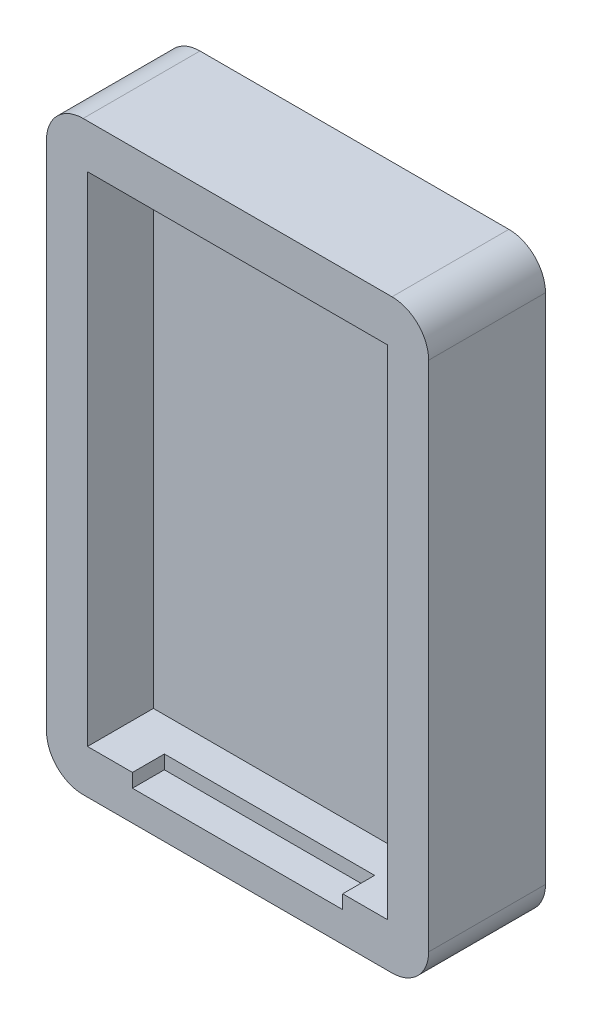
ISO-10303-21;
HEADER;
FILE_DESCRIPTION(('STEP AP214'),'2;1');
FILE_NAME('part.step','',(''),(''),'','','');
FILE_SCHEMA(('AUTOMOTIVE_DESIGN { 1 0 10303 214 1 1 1 1 }'));
ENDSEC;
DATA;
#1=APPLICATION_CONTEXT('core data for automotive mechanical design processes');
#2=APPLICATION_PROTOCOL_DEFINITION('international standard','automotive_design',2000,#1);
#3=PRODUCT_CONTEXT('',#1,'mechanical');
#4=PRODUCT('Part','Part','',(#3));
#5=PRODUCT_RELATED_PRODUCT_CATEGORY('part','',(#4));
#6=PRODUCT_DEFINITION_FORMATION('','',#4);
#7=PRODUCT_DEFINITION_CONTEXT('part definition',#1,'design');
#8=PRODUCT_DEFINITION('design','',#6,#7);
#9=PRODUCT_DEFINITION_SHAPE('','',#8);
#10=(LENGTH_UNIT() NAMED_UNIT(*) SI_UNIT(.MILLI.,.METRE.));
#11=(NAMED_UNIT(*) PLANE_ANGLE_UNIT() SI_UNIT($,.RADIAN.));
#12=(NAMED_UNIT(*) SI_UNIT($,.STERADIAN.) SOLID_ANGLE_UNIT());
#13=UNCERTAINTY_MEASURE_WITH_UNIT(LENGTH_MEASURE(1.E-05),#10,'distance_accuracy_value','');
#14=(GEOMETRIC_REPRESENTATION_CONTEXT(3) GLOBAL_UNCERTAINTY_ASSIGNED_CONTEXT((#13)) GLOBAL_UNIT_ASSIGNED_CONTEXT((#10,
#11,#12)) REPRESENTATION_CONTEXT('',''));
#15=CARTESIAN_POINT('',(0.,0.,0.));
#16=DIRECTION('',(0.,0.,1.));
#17=DIRECTION('',(1.,0.,0.));
#18=AXIS2_PLACEMENT_3D('',#15,#16,#17);
#19=CARTESIAN_POINT('',(17.8228337302219,-28.6808217788499,-0.869219482411513));
#20=DIRECTION('',(0.,0.,1.));
#21=DIRECTION('',(1.,0.,0.));
#22=AXIS2_PLACEMENT_3D('',#19,#20,#21);
#23=PLANE('',#22);
#24=CARTESIAN_POINT('',(-103.2770625763,171.81781820729,-0.869219482411513));
#25=DIRECTION('',(0.,0.,-1.));
#26=DIRECTION('',(0.999491561090101,-0.0318844681572752,0.));
#27=AXIS2_PLACEMENT_3D('',#24,#25,#26);
#28=ELLIPSE('',#27,16.5689936961627,16.3639975368076);
#29=CARTESIAN_POINT('',(-86.7164932012302,171.289524655387,-0.869219482411513));
#30=VERTEX_POINT('',#29);
#31=CARTESIAN_POINT('',(-119.837631828693,172.346115604763,-0.869219482411513));
#32=VERTEX_POINT('',#31);
#33=EDGE_CURVE('E254',#30,#32,#28,.T.);
#34=ORIENTED_EDGE('',*,*,#33,.F.);
#35=CARTESIAN_POINT('',(-103.187550418865,202.39162856633,-0.869219482411513));
#36=CARTESIAN_POINT('',(-97.0157481711161,192.57981872265,-0.869219482411513));
#37=CARTESIAN_POINT('',(-86.9706131775563,183.759430538106,-0.869219482411513));
#38=CARTESIAN_POINT('',(-86.7164930785539,171.289528500957,-0.869219482411513));
#39=B_SPLINE_CURVE_WITH_KNOTS('',3,(#35,#36,#37,#38),.UNSPECIFIED.,.F.,.F.,(4,4),(0.,1.),.UNSPECIFIED.);
#40=CARTESIAN_POINT('',(-103.187550418865,202.39162856633,-0.869219482411513));
#41=VERTEX_POINT('',#40);
#42=EDGE_CURVE('E54',#41,#30,#39,.T.);
#43=ORIENTED_EDGE('',*,*,#42,.F.);
#44=CARTESIAN_POINT('',(-103.187550418865,202.39162856633,-0.869219482411513));
#45=CARTESIAN_POINT('',(-109.364943968374,193.194693065367,-0.869219482411513));
#46=CARTESIAN_POINT('',(-118.472658707236,183.975428389587,-0.869219482411513));
#47=CARTESIAN_POINT('',(-119.837631828693,172.346115604763,-0.869219482411513));
#48=B_SPLINE_CURVE_WITH_KNOTS('',3,(#44,#45,#46,#47),.UNSPECIFIED.,.F.,.F.,(4,4),(0.,1.),.UNSPECIFIED.);
#49=EDGE_CURVE('E522',#41,#32,#48,.T.);
#50=ORIENTED_EDGE('',*,*,#49,.T.);
#51=EDGE_LOOP('',(#34,#43,#50));
#52=FACE_BOUND('',#51,.T.);
#53=DIRECTION('',(-1.,0.,0.));
#54=VECTOR('',#53,1.);
#55=CARTESIAN_POINT('',(17.8228337302219,197.176670786636,-0.869219482411513));
#56=LINE('',#55,#54);
#57=CARTESIAN_POINT('',(-127.369816398849,197.176670786636,-0.869219482411513));
#58=VERTEX_POINT('',#57);
#59=CARTESIAN_POINT('',(-134.441969819244,197.176670786636,-0.869219482411513));
#60=VERTEX_POINT('',#59);
#61=EDGE_CURVE('E237',#58,#60,#56,.T.);
#62=ORIENTED_EDGE('',*,*,#61,.T.);
#63=DIRECTION('',(0.,-1.,0.));
#64=VECTOR('',#63,1.);
#65=CARTESIAN_POINT('',(-134.441969819244,-28.6808217788499,-0.869219482411513));
#66=LINE('',#65,#64);
#67=CARTESIAN_POINT('',(-134.441969819244,174.673309565571,-0.869219482411513));
#68=VERTEX_POINT('',#67);
#69=EDGE_CURVE('E241',#60,#68,#66,.T.);
#70=ORIENTED_EDGE('',*,*,#69,.T.);
#71=DIRECTION('',(1.,0.,0.));
#72=VECTOR('',#71,1.);
#73=CARTESIAN_POINT('',(17.8228337302219,174.673309565571,-0.869219482411513));
#74=LINE('',#73,#72);
#75=CARTESIAN_POINT('',(-127.106833584018,174.673309565571,-0.869219482411513));
#76=VERTEX_POINT('',#75);
#77=EDGE_CURVE('E501',#68,#76,#74,.T.);
#78=ORIENTED_EDGE('',*,*,#77,.T.);
#79=DIRECTION('',(-0.0116855813721816,0.999931721263004,0.));
#80=VECTOR('',#79,1.);
#81=CARTESIAN_POINT('',(-124.710894032739,-30.3465249850154,-0.869219482411513));
#82=LINE('',#81,#80);
#83=EDGE_CURVE('E497',#76,#58,#82,.T.);
#84=ORIENTED_EDGE('',*,*,#83,.T.);
#85=EDGE_LOOP('',(#62,#70,#78,#84));
#86=FACE_BOUND('',#85,.T.);
#87=DIRECTION('',(0.,1.,0.));
#88=VECTOR('',#87,1.);
#89=CARTESIAN_POINT('',(-84.9322670141432,218.727352077467,-0.869219482411513));
#90=LINE('',#89,#88);
#91=CARTESIAN_POINT('',(-84.9322670141432,143.727352077467,-0.869219482411513));
#92=VERTEX_POINT('',#91);
#93=CARTESIAN_POINT('',(-84.9322670141432,213.727352077467,-0.869219482411513));
#94=VERTEX_POINT('',#93);
#95=EDGE_CURVE('E399',#92,#94,#90,.T.);
#96=ORIENTED_EDGE('',*,*,#95,.F.);
#97=CARTESIAN_POINT('',(-89.9322670141432,143.727352077467,-0.869219482411513));
#98=DIRECTION('',(0.,0.,1.));
#99=DIRECTION('',(1.,0.,0.));
#100=AXIS2_PLACEMENT_3D('',#97,#98,#99);
#101=CIRCLE('',#100,5.);
#102=CARTESIAN_POINT('',(-89.9322670141432,138.727352077467,-0.869219482411513));
#103=VERTEX_POINT('',#102);
#104=EDGE_CURVE('E386',#92,#103,#101,.F.);
#105=ORIENTED_EDGE('',*,*,#104,.T.);
#106=DIRECTION('',(1.,0.,0.));
#107=VECTOR('',#106,1.);
#108=CARTESIAN_POINT('',(-137.132267014143,138.727352077467,-0.869219482411513));
#109=LINE('',#108,#107);
#110=CARTESIAN_POINT('',(-132.132267014143,138.727352077467,-0.869219482411513));
#111=VERTEX_POINT('',#110);
#112=EDGE_CURVE('E402',#111,#103,#109,.T.);
#113=ORIENTED_EDGE('',*,*,#112,.F.);
#114=CARTESIAN_POINT('',(-132.132267014143,143.727352077467,-0.869219482411513));
#115=DIRECTION('',(0.,0.,1.));
#116=DIRECTION('',(1.,0.,0.));
#117=AXIS2_PLACEMENT_3D('',#114,#115,#116);
#118=CIRCLE('',#117,5.);
#119=CARTESIAN_POINT('',(-137.132267014143,143.727352077467,-0.869219482411513));
#120=VERTEX_POINT('',#119);
#121=EDGE_CURVE('E388',#111,#120,#118,.F.);
#122=ORIENTED_EDGE('',*,*,#121,.T.);
#123=DIRECTION('',(0.,-1.,0.));
#124=VECTOR('',#123,1.);
#125=CARTESIAN_POINT('',(-137.132267014143,218.727352077467,-0.869219482411513));
#126=LINE('',#125,#124);
#127=CARTESIAN_POINT('',(-137.132267014143,213.727352077467,-0.869219482411513));
#128=VERTEX_POINT('',#127);
#129=EDGE_CURVE('E405',#128,#120,#126,.T.);
#130=ORIENTED_EDGE('',*,*,#129,.F.);
#131=CARTESIAN_POINT('',(-132.132267014143,213.727352077467,-0.869219482411513));
#132=DIRECTION('',(0.,0.,1.));
#133=DIRECTION('',(1.,0.,0.));
#134=AXIS2_PLACEMENT_3D('',#131,#132,#133);
#135=CIRCLE('',#134,5.);
#136=CARTESIAN_POINT('',(-132.132267014143,218.727352077467,-0.869219482411513));
#137=VERTEX_POINT('',#136);
#138=EDGE_CURVE('E391',#128,#137,#135,.F.);
#139=ORIENTED_EDGE('',*,*,#138,.T.);
#140=DIRECTION('',(-1.,0.,0.));
#141=VECTOR('',#140,1.);
#142=CARTESIAN_POINT('',(-137.132267014143,218.727352077467,-0.869219482411513));
#143=LINE('',#142,#141);
#144=CARTESIAN_POINT('',(-89.9322670141432,218.727352077467,-0.869219482411513));
#145=VERTEX_POINT('',#144);
#146=EDGE_CURVE('E397',#145,#137,#143,.T.);
#147=ORIENTED_EDGE('',*,*,#146,.F.);
#148=CARTESIAN_POINT('',(-89.9322670141432,213.727352077467,-0.869219482411513));
#149=DIRECTION('',(0.,0.,1.));
#150=DIRECTION('',(1.,0.,0.));
#151=AXIS2_PLACEMENT_3D('',#148,#149,#150);
#152=CIRCLE('',#151,5.);
#153=EDGE_CURVE('E368',#145,#94,#152,.F.);
#154=ORIENTED_EDGE('',*,*,#153,.T.);
#155=EDGE_LOOP('',(#96,#105,#113,#122,#130,#139,#147,#154));
#156=FACE_BOUND('',#155,.T.);
#157=DIRECTION('',(-1.,0.,0.));
#158=VECTOR('',#157,1.);
#159=CARTESIAN_POINT('',(17.8228337302219,167.347465132639,-0.869219482411513));
#160=LINE('',#159,#158);
#161=CARTESIAN_POINT('',(-127.238324991433,167.347465132639,-0.869219482411513));
#162=VERTEX_POINT('',#161);
#163=CARTESIAN_POINT('',(-134.441969819244,167.347465132639,-0.869219482411513));
#164=VERTEX_POINT('',#163);
#165=EDGE_CURVE('E62',#162,#164,#160,.T.);
#166=ORIENTED_EDGE('',*,*,#165,.T.);
#167=DIRECTION('',(0.,-1.,0.));
#168=VECTOR('',#167,1.);
#169=CARTESIAN_POINT('',(-134.441969819244,-28.6808217788499,-0.869219482411513));
#170=LINE('',#169,#168);
#171=CARTESIAN_POINT('',(-134.441969819244,159.766019029818,-0.869219482411513));
#172=VERTEX_POINT('',#171);
#173=EDGE_CURVE('E236',#164,#172,#170,.T.);
#174=ORIENTED_EDGE('',*,*,#173,.T.);
#175=DIRECTION('',(1.,0.,0.));
#176=VECTOR('',#175,1.);
#177=CARTESIAN_POINT('',(17.8228337302219,159.766019029818,-0.869219482411513));
#178=LINE('',#177,#176);
#179=CARTESIAN_POINT('',(-127.238324991433,159.766019029818,-0.869219482411513));
#180=VERTEX_POINT('',#179);
#181=EDGE_CURVE('E842',#172,#180,#178,.T.);
#182=ORIENTED_EDGE('',*,*,#181,.T.);
#183=DIRECTION('',(0.,1.,0.));
#184=VECTOR('',#183,1.);
#185=CARTESIAN_POINT('',(-127.238324991433,-28.6808217788499,-0.869219482411513));
#186=LINE('',#185,#184);
#187=EDGE_CURVE('E232',#180,#162,#186,.T.);
#188=ORIENTED_EDGE('',*,*,#187,.T.);
#189=EDGE_LOOP('',(#166,#174,#182,#188));
#190=FACE_BOUND('',#189,.T.);
#191=ADVANCED_FACE('F39',(#52,#86,#156,#190),#23,.F.);
#192=CARTESIAN_POINT('',(-137.132267014143,218.727352077467,22.3307805175885));
#193=DIRECTION('',(1.,0.,0.));
#194=DIRECTION('',(0.,0.,-1.));
#195=AXIS2_PLACEMENT_3D('',#192,#193,#194);
#196=PLANE('',#195);
#197=DIRECTION('',(0.,-1.,0.));
#198=VECTOR('',#197,1.);
#199=CARTESIAN_POINT('',(-137.132267014143,218.727352077467,15.0923805175885));
#200=LINE('',#199,#198);
#201=CARTESIAN_POINT('',(-137.132267014143,213.727352077467,15.0923805175885));
#202=VERTEX_POINT('',#201);
#203=CARTESIAN_POINT('',(-137.132267014143,143.727352077467,15.0923805175885));
#204=VERTEX_POINT('',#203);
#205=EDGE_CURVE('E484',#202,#204,#200,.T.);
#206=ORIENTED_EDGE('',*,*,#205,.F.);
#207=DIRECTION('',(0.,0.,-1.));
#208=VECTOR('',#207,1.);
#209=CARTESIAN_POINT('',(-137.132267014143,213.727352077467,22.3307805175885));
#210=LINE('',#209,#208);
#211=EDGE_CURVE('E379',#202,#128,#210,.T.);
#212=ORIENTED_EDGE('',*,*,#211,.T.);
#213=ORIENTED_EDGE('',*,*,#129,.T.);
#214=DIRECTION('',(0.,0.,-1.));
#215=VECTOR('',#214,1.);
#216=CARTESIAN_POINT('',(-137.132267014143,143.727352077467,22.3307805175885));
#217=LINE('',#216,#215);
#218=EDGE_CURVE('E374',#120,#204,#217,.F.);
#219=ORIENTED_EDGE('',*,*,#218,.T.);
#220=EDGE_LOOP('',(#206,#212,#213,#219));
#221=FACE_BOUND('',#220,.T.);
#222=ADVANCED_FACE('F331',(#221),#196,.F.);
#223=CARTESIAN_POINT('',(-137.132267014143,138.727352077467,22.3307805175885));
#224=DIRECTION('',(0.,1.,0.));
#225=DIRECTION('',(0.,0.,1.));
#226=AXIS2_PLACEMENT_3D('',#223,#224,#225);
#227=PLANE('',#226);
#228=DIRECTION('',(1.,0.,0.));
#229=VECTOR('',#228,1.);
#230=CARTESIAN_POINT('',(-137.132267014143,138.727352077467,15.0923805175885));
#231=LINE('',#230,#229);
#232=CARTESIAN_POINT('',(-132.132267014143,138.727352077467,15.0923805175885));
#233=VERTEX_POINT('',#232);
#234=CARTESIAN_POINT('',(-89.9322670141432,138.727352077467,15.0923805175885));
#235=VERTEX_POINT('',#234);
#236=EDGE_CURVE('E482',#233,#235,#231,.T.);
#237=ORIENTED_EDGE('',*,*,#236,.F.);
#238=DIRECTION('',(0.,0.,-1.));
#239=VECTOR('',#238,1.);
#240=CARTESIAN_POINT('',(-132.132267014143,138.727352077467,22.3307805175885));
#241=LINE('',#240,#239);
#242=EDGE_CURVE('E384',#233,#111,#241,.T.);
#243=ORIENTED_EDGE('',*,*,#242,.T.);
#244=ORIENTED_EDGE('',*,*,#112,.T.);
#245=DIRECTION('',(0.,0.,-1.));
#246=VECTOR('',#245,1.);
#247=CARTESIAN_POINT('',(-89.9322670141432,138.727352077467,22.3307805175885));
#248=LINE('',#247,#246);
#249=EDGE_CURVE('E381',#103,#235,#248,.F.);
#250=ORIENTED_EDGE('',*,*,#249,.T.);
#251=EDGE_LOOP('',(#237,#243,#244,#250));
#252=FACE_BOUND('',#251,.T.);
#253=ADVANCED_FACE('F341',(#252),#227,.F.);
#254=CARTESIAN_POINT('',(-84.9322670141432,218.727352077467,22.3307805175885));
#255=DIRECTION('',(-1.,0.,0.));
#256=DIRECTION('',(0.,-1.,0.));
#257=AXIS2_PLACEMENT_3D('',#254,#255,#256);
#258=PLANE('',#257);
#259=DIRECTION('',(0.,1.,0.));
#260=VECTOR('',#259,1.);
#261=CARTESIAN_POINT('',(-84.9322670141432,218.727352077467,15.0923805175885));
#262=LINE('',#261,#260);
#263=CARTESIAN_POINT('',(-84.9322670141432,143.727352077467,15.0923805175885));
#264=VERTEX_POINT('',#263);
#265=CARTESIAN_POINT('',(-84.9322670141432,213.727352077467,15.0923805175885));
#266=VERTEX_POINT('',#265);
#267=EDGE_CURVE('E480',#264,#266,#262,.T.);
#268=ORIENTED_EDGE('',*,*,#267,.F.);
#269=DIRECTION('',(0.,0.,-1.));
#270=VECTOR('',#269,1.);
#271=CARTESIAN_POINT('',(-84.9322670141432,143.727352077467,22.3307805175885));
#272=LINE('',#271,#270);
#273=EDGE_CURVE('E393',#264,#92,#272,.T.);
#274=ORIENTED_EDGE('',*,*,#273,.T.);
#275=ORIENTED_EDGE('',*,*,#95,.T.);
#276=DIRECTION('',(0.,0.,-1.));
#277=VECTOR('',#276,1.);
#278=CARTESIAN_POINT('',(-84.9322670141432,213.727352077467,22.3307805175885));
#279=LINE('',#278,#277);
#280=EDGE_CURVE('E395',#94,#266,#279,.F.);
#281=ORIENTED_EDGE('',*,*,#280,.T.);
#282=EDGE_LOOP('',(#268,#274,#275,#281));
#283=FACE_BOUND('',#282,.T.);
#284=ADVANCED_FACE('F337',(#283),#258,.F.);
#285=CARTESIAN_POINT('',(-137.132267014143,218.727352077467,22.3307805175885));
#286=DIRECTION('',(0.,-1.,0.));
#287=DIRECTION('',(0.,0.,-1.));
#288=AXIS2_PLACEMENT_3D('',#285,#286,#287);
#289=PLANE('',#288);
#290=DIRECTION('',(-1.,0.,0.));
#291=VECTOR('',#290,1.);
#292=CARTESIAN_POINT('',(-137.132267014143,218.727352077467,15.0923805175885));
#293=LINE('',#292,#291);
#294=CARTESIAN_POINT('',(-89.9322670141432,218.727352077467,15.0923805175885));
#295=VERTEX_POINT('',#294);
#296=CARTESIAN_POINT('',(-132.132267014143,218.727352077467,15.0923805175885));
#297=VERTEX_POINT('',#296);
#298=EDGE_CURVE('E478',#295,#297,#293,.T.);
#299=ORIENTED_EDGE('',*,*,#298,.F.);
#300=DIRECTION('',(0.,0.,-1.));
#301=VECTOR('',#300,1.);
#302=CARTESIAN_POINT('',(-89.9322670141432,218.727352077467,22.3307805175885));
#303=LINE('',#302,#301);
#304=EDGE_CURVE('E47',#295,#145,#303,.T.);
#305=ORIENTED_EDGE('',*,*,#304,.T.);
#306=ORIENTED_EDGE('',*,*,#146,.T.);
#307=DIRECTION('',(0.,0.,-1.));
#308=VECTOR('',#307,1.);
#309=CARTESIAN_POINT('',(-132.132267014143,218.727352077467,22.3307805175885));
#310=LINE('',#309,#308);
#311=EDGE_CURVE('E372',#137,#297,#310,.F.);
#312=ORIENTED_EDGE('',*,*,#311,.T.);
#313=EDGE_LOOP('',(#299,#305,#306,#312));
#314=FACE_BOUND('',#313,.T.);
#315=ADVANCED_FACE('F333',(#314),#289,.F.);
#316=CARTESIAN_POINT('',(-89.9322670141432,143.727352077467,22.3307805175885));
#317=DIRECTION('',(0.,0.,-1.));
#318=DIRECTION('',(-1.,0.,0.));
#319=AXIS2_PLACEMENT_3D('',#316,#317,#318);
#320=CYLINDRICAL_SURFACE('',#319,5.);
#321=ORIENTED_EDGE('',*,*,#273,.F.);
#322=CARTESIAN_POINT('',(-89.9322670141432,143.727352077467,15.0923805175885));
#323=DIRECTION('',(0.,0.,1.));
#324=DIRECTION('',(1.,0.,0.));
#325=AXIS2_PLACEMENT_3D('',#322,#323,#324);
#326=CIRCLE('',#325,5.);
#327=EDGE_CURVE('E455',#264,#235,#326,.F.);
#328=ORIENTED_EDGE('',*,*,#327,.T.);
#329=ORIENTED_EDGE('',*,*,#249,.F.);
#330=ORIENTED_EDGE('',*,*,#104,.F.);
#331=EDGE_LOOP('',(#321,#328,#329,#330));
#332=FACE_BOUND('',#331,.T.);
#333=ADVANCED_FACE('F336',(#332),#320,.T.);
#334=CARTESIAN_POINT('',(-132.132267014143,143.727352077467,22.3307805175885));
#335=DIRECTION('',(0.,0.,-1.));
#336=DIRECTION('',(-1.,0.,0.));
#337=AXIS2_PLACEMENT_3D('',#334,#335,#336);
#338=CYLINDRICAL_SURFACE('',#337,5.);
#339=ORIENTED_EDGE('',*,*,#242,.F.);
#340=CARTESIAN_POINT('',(-132.132267014143,143.727352077467,15.0923805175885));
#341=DIRECTION('',(0.,0.,1.));
#342=DIRECTION('',(1.,0.,0.));
#343=AXIS2_PLACEMENT_3D('',#340,#341,#342);
#344=CIRCLE('',#343,5.);
#345=EDGE_CURVE('E458',#233,#204,#344,.F.);
#346=ORIENTED_EDGE('',*,*,#345,.T.);
#347=ORIENTED_EDGE('',*,*,#218,.F.);
#348=ORIENTED_EDGE('',*,*,#121,.F.);
#349=EDGE_LOOP('',(#339,#346,#347,#348));
#350=FACE_BOUND('',#349,.T.);
#351=ADVANCED_FACE('F351',(#350),#338,.T.);
#352=CARTESIAN_POINT('',(-89.9322670141432,213.727352077467,22.3307805175885));
#353=DIRECTION('',(0.,0.,-1.));
#354=DIRECTION('',(-1.,0.,0.));
#355=AXIS2_PLACEMENT_3D('',#352,#353,#354);
#356=CYLINDRICAL_SURFACE('',#355,5.);
#357=ORIENTED_EDGE('',*,*,#304,.F.);
#358=CARTESIAN_POINT('',(-89.9322670141432,213.727352077467,15.0923805175885));
#359=DIRECTION('',(0.,0.,1.));
#360=DIRECTION('',(1.,0.,0.));
#361=AXIS2_PLACEMENT_3D('',#358,#359,#360);
#362=CIRCLE('',#361,5.);
#363=EDGE_CURVE('E366',#295,#266,#362,.F.);
#364=ORIENTED_EDGE('',*,*,#363,.T.);
#365=ORIENTED_EDGE('',*,*,#280,.F.);
#366=ORIENTED_EDGE('',*,*,#153,.F.);
#367=EDGE_LOOP('',(#357,#364,#365,#366));
#368=FACE_BOUND('',#367,.T.);
#369=ADVANCED_FACE('F354',(#368),#356,.T.);
#370=CARTESIAN_POINT('',(-132.132267014143,213.727352077467,22.3307805175885));
#371=DIRECTION('',(0.,0.,-1.));
#372=DIRECTION('',(-1.,0.,0.));
#373=AXIS2_PLACEMENT_3D('',#370,#371,#372);
#374=CYLINDRICAL_SURFACE('',#373,5.);
#375=ORIENTED_EDGE('',*,*,#211,.F.);
#376=CARTESIAN_POINT('',(-132.132267014143,213.727352077467,15.0923805175885));
#377=DIRECTION('',(0.,0.,1.));
#378=DIRECTION('',(1.,0.,0.));
#379=AXIS2_PLACEMENT_3D('',#376,#377,#378);
#380=CIRCLE('',#379,5.);
#381=EDGE_CURVE('E462',#202,#297,#380,.F.);
#382=ORIENTED_EDGE('',*,*,#381,.T.);
#383=ORIENTED_EDGE('',*,*,#311,.F.);
#384=ORIENTED_EDGE('',*,*,#138,.F.);
#385=EDGE_LOOP('',(#375,#382,#383,#384));
#386=FACE_BOUND('',#385,.T.);
#387=ADVANCED_FACE('F41',(#386),#374,.T.);
#388=CARTESIAN_POINT('',(17.8228337302219,-28.6808217788499,15.0923805175885));
#389=DIRECTION('',(0.,0.,1.));
#390=DIRECTION('',(1.,0.,0.));
#391=AXIS2_PLACEMENT_3D('',#388,#389,#390);
#392=PLANE('',#391);
#393=ORIENTED_EDGE('',*,*,#267,.T.);
#394=ORIENTED_EDGE('',*,*,#363,.F.);
#395=ORIENTED_EDGE('',*,*,#298,.T.);
#396=ORIENTED_EDGE('',*,*,#381,.F.);
#397=ORIENTED_EDGE('',*,*,#205,.T.);
#398=ORIENTED_EDGE('',*,*,#345,.F.);
#399=ORIENTED_EDGE('',*,*,#236,.T.);
#400=ORIENTED_EDGE('',*,*,#327,.F.);
#401=EDGE_LOOP('',(#393,#394,#395,#396,#397,#398,#399,#400));
#402=FACE_BOUND('',#401,.T.);
#403=DIRECTION('',(0.,1.,0.));
#404=VECTOR('',#403,1.);
#405=CARTESIAN_POINT('',(-131.532267254143,212.730152077467,15.0923805175885));
#406=LINE('',#405,#404);
#407=CARTESIAN_POINT('',(-131.532267254143,144.730152077467,15.0923805175885));
#408=VERTEX_POINT('',#407);
#409=CARTESIAN_POINT('',(-131.532267254143,212.730152077467,15.0923805175885));
#410=VERTEX_POINT('',#409);
#411=EDGE_CURVE('E465',#408,#410,#406,.T.);
#412=ORIENTED_EDGE('',*,*,#411,.T.);
#413=DIRECTION('',(1.,0.,0.));
#414=VECTOR('',#413,1.);
#415=CARTESIAN_POINT('',(-131.532267254143,212.730152077467,15.0923805175885));
#416=LINE('',#415,#414);
#417=CARTESIAN_POINT('',(-90.5322672541432,212.730152077467,15.0923805175885));
#418=VERTEX_POINT('',#417);
#419=EDGE_CURVE('E467',#410,#418,#416,.T.);
#420=ORIENTED_EDGE('',*,*,#419,.T.);
#421=DIRECTION('',(0.,-1.,0.));
#422=VECTOR('',#421,1.);
#423=CARTESIAN_POINT('',(-90.5322672541432,212.730152077467,15.0923805175885));
#424=LINE('',#423,#422);
#425=CARTESIAN_POINT('',(-90.5322672541431,144.730152077467,15.0923805175885));
#426=VERTEX_POINT('',#425);
#427=EDGE_CURVE('E469',#418,#426,#424,.T.);
#428=ORIENTED_EDGE('',*,*,#427,.T.);
#429=DIRECTION('',(-1.,0.,0.));
#430=VECTOR('',#429,1.);
#431=CARTESIAN_POINT('',(-131.532267254143,144.730152077467,15.0923805175885));
#432=LINE('',#431,#430);
#433=CARTESIAN_POINT('',(-96.6722672541431,144.730152077467,15.0923805175885));
#434=VERTEX_POINT('',#433);
#435=EDGE_CURVE('E471',#426,#434,#432,.T.);
#436=ORIENTED_EDGE('',*,*,#435,.T.);
#437=DIRECTION('',(0.,-1.,0.));
#438=VECTOR('',#437,1.);
#439=CARTESIAN_POINT('',(-96.6722672541431,144.730152077467,15.0923805175885));
#440=LINE('',#439,#438);
#441=CARTESIAN_POINT('',(-96.6722672541431,142.858344077467,15.0923805175885));
#442=VERTEX_POINT('',#441);
#443=EDGE_CURVE('E476',#434,#442,#440,.T.);
#444=ORIENTED_EDGE('',*,*,#443,.T.);
#445=DIRECTION('',(-1.,0.,0.));
#446=VECTOR('',#445,1.);
#447=CARTESIAN_POINT('',(-125.392267254143,142.858344077467,15.0923805175885));
#448=LINE('',#447,#446);
#449=CARTESIAN_POINT('',(-125.392267254143,142.858344077467,15.0923805175885));
#450=VERTEX_POINT('',#449);
#451=EDGE_CURVE('E11',#442,#450,#448,.T.);
#452=ORIENTED_EDGE('',*,*,#451,.T.);
#453=DIRECTION('',(0.,1.,0.));
#454=VECTOR('',#453,1.);
#455=CARTESIAN_POINT('',(-125.392267254143,144.730152077467,15.0923805175885));
#456=LINE('',#455,#454);
#457=CARTESIAN_POINT('',(-125.392267254143,144.730152077467,15.0923805175885));
#458=VERTEX_POINT('',#457);
#459=EDGE_CURVE('E474',#450,#458,#456,.T.);
#460=ORIENTED_EDGE('',*,*,#459,.T.);
#461=EDGE_CURVE('E472',#458,#408,#432,.T.);
#462=ORIENTED_EDGE('',*,*,#461,.T.);
#463=EDGE_LOOP('',(#412,#420,#428,#436,#444,#452,#460,#462));
#464=FACE_BOUND('',#463,.T.);
#465=ADVANCED_FACE('F290',(#402,#464),#392,.T.);
#466=CARTESIAN_POINT('',(17.8228337302219,-28.6808217788499,6.09078051758849));
#467=DIRECTION('',(0.,0.,1.));
#468=DIRECTION('',(1.,0.,0.));
#469=AXIS2_PLACEMENT_3D('',#466,#467,#468);
#470=PLANE('',#469);
#471=DIRECTION('',(0.,-1.,0.));
#472=VECTOR('',#471,1.);
#473=CARTESIAN_POINT('',(-131.532267254143,212.730152077467,6.09078051758849));
#474=LINE('',#473,#472);
#475=CARTESIAN_POINT('',(-131.532267254143,212.730152077467,6.09078051758849));
#476=VERTEX_POINT('',#475);
#477=CARTESIAN_POINT('',(-131.532267254143,144.730152077467,6.09078051758849));
#478=VERTEX_POINT('',#477);
#479=EDGE_CURVE('E429',#476,#478,#474,.T.);
#480=ORIENTED_EDGE('',*,*,#479,.T.);
#481=DIRECTION('',(1.,0.,0.));
#482=VECTOR('',#481,1.);
#483=CARTESIAN_POINT('',(-131.532267254143,144.730152077467,6.09078051758849));
#484=LINE('',#483,#482);
#485=CARTESIAN_POINT('',(-90.5322672541431,144.730152077467,6.09078051758849));
#486=VERTEX_POINT('',#485);
#487=EDGE_CURVE('E426',#478,#486,#484,.T.);
#488=ORIENTED_EDGE('',*,*,#487,.T.);
#489=DIRECTION('',(0.,1.,0.));
#490=VECTOR('',#489,1.);
#491=CARTESIAN_POINT('',(-90.5322672541432,212.730152077467,6.09078051758849));
#492=LINE('',#491,#490);
#493=CARTESIAN_POINT('',(-90.5322672541432,212.730152077467,6.09078051758849));
#494=VERTEX_POINT('',#493);
#495=EDGE_CURVE('E423',#486,#494,#492,.T.);
#496=ORIENTED_EDGE('',*,*,#495,.T.);
#497=DIRECTION('',(-1.,0.,0.));
#498=VECTOR('',#497,1.);
#499=CARTESIAN_POINT('',(-131.532267254143,212.730152077467,6.09078051758849));
#500=LINE('',#499,#498);
#501=EDGE_CURVE('E413',#494,#476,#500,.T.);
#502=ORIENTED_EDGE('',*,*,#501,.T.);
#503=EDGE_LOOP('',(#480,#488,#496,#502));
#504=FACE_BOUND('',#503,.T.);
#505=ADVANCED_FACE('F293',(#504),#470,.T.);
#506=CARTESIAN_POINT('',(17.8228337302219,-28.6808217788499,10.7307805175885));
#507=DIRECTION('',(0.,0.,1.));
#508=DIRECTION('',(1.,0.,0.));
#509=AXIS2_PLACEMENT_3D('',#506,#507,#508);
#510=PLANE('',#509);
#511=DIRECTION('',(0.,-1.,0.));
#512=VECTOR('',#511,1.);
#513=CARTESIAN_POINT('',(-125.392267254143,144.730152077467,10.7307805175885));
#514=LINE('',#513,#512);
#515=CARTESIAN_POINT('',(-125.392267254143,144.730152077467,10.7307805175885));
#516=VERTEX_POINT('',#515);
#517=CARTESIAN_POINT('',(-125.392267254143,142.858344077467,10.7307805175885));
#518=VERTEX_POINT('',#517);
#519=EDGE_CURVE('E452',#516,#518,#514,.T.);
#520=ORIENTED_EDGE('',*,*,#519,.T.);
#521=DIRECTION('',(1.,0.,0.));
#522=VECTOR('',#521,1.);
#523=CARTESIAN_POINT('',(-125.392267254143,142.858344077467,10.7307805175885));
#524=LINE('',#523,#522);
#525=CARTESIAN_POINT('',(-96.6722672541431,142.858344077467,10.7307805175885));
#526=VERTEX_POINT('',#525);
#527=EDGE_CURVE('E449',#518,#526,#524,.T.);
#528=ORIENTED_EDGE('',*,*,#527,.T.);
#529=DIRECTION('',(0.,1.,0.));
#530=VECTOR('',#529,1.);
#531=CARTESIAN_POINT('',(-96.6722672541431,144.730152077467,10.7307805175885));
#532=LINE('',#531,#530);
#533=CARTESIAN_POINT('',(-96.6722672541431,144.730152077467,10.7307805175885));
#534=VERTEX_POINT('',#533);
#535=EDGE_CURVE('E447',#526,#534,#532,.T.);
#536=ORIENTED_EDGE('',*,*,#535,.T.);
#537=DIRECTION('',(-1.,0.,0.));
#538=VECTOR('',#537,1.);
#539=CARTESIAN_POINT('',(-125.392267254143,144.730152077467,10.7307805175885));
#540=LINE('',#539,#538);
#541=EDGE_CURVE('E437',#534,#516,#540,.T.);
#542=ORIENTED_EDGE('',*,*,#541,.T.);
#543=EDGE_LOOP('',(#520,#528,#536,#542));
#544=FACE_BOUND('',#543,.T.);
#545=ADVANCED_FACE('F295',(#544),#510,.T.);
#546=CARTESIAN_POINT('',(-125.392267254143,142.858344077467,10.7307805175885));
#547=DIRECTION('',(0.,-1.,0.));
#548=DIRECTION('',(0.,0.,-1.));
#549=AXIS2_PLACEMENT_3D('',#546,#547,#548);
#550=PLANE('',#549);
#551=ORIENTED_EDGE('',*,*,#451,.F.);
#552=DIRECTION('',(0.,0.,1.));
#553=VECTOR('',#552,1.);
#554=CARTESIAN_POINT('',(-96.6722672541431,142.858344077467,10.7307805175885));
#555=LINE('',#554,#553);
#556=EDGE_CURVE('E436',#526,#442,#555,.T.);
#557=ORIENTED_EDGE('',*,*,#556,.F.);
#558=ORIENTED_EDGE('',*,*,#527,.F.);
#559=DIRECTION('',(0.,0.,1.));
#560=VECTOR('',#559,1.);
#561=CARTESIAN_POINT('',(-125.392267254143,142.858344077467,10.7307805175885));
#562=LINE('',#561,#560);
#563=EDGE_CURVE('E433',#518,#450,#562,.T.);
#564=ORIENTED_EDGE('',*,*,#563,.T.);
#565=EDGE_LOOP('',(#551,#557,#558,#564));
#566=FACE_BOUND('',#565,.T.);
#567=ADVANCED_FACE('F298',(#566),#550,.F.);
#568=CARTESIAN_POINT('',(-96.6722672541431,144.730152077467,10.7307805175885));
#569=DIRECTION('',(1.,0.,0.));
#570=DIRECTION('',(0.,0.,-1.));
#571=AXIS2_PLACEMENT_3D('',#568,#569,#570);
#572=PLANE('',#571);
#573=ORIENTED_EDGE('',*,*,#443,.F.);
#574=DIRECTION('',(0.,0.,1.));
#575=VECTOR('',#574,1.);
#576=CARTESIAN_POINT('',(-96.6722672541431,144.730152077467,10.7307805175885));
#577=LINE('',#576,#575);
#578=EDGE_CURVE('E440',#534,#434,#577,.T.);
#579=ORIENTED_EDGE('',*,*,#578,.F.);
#580=ORIENTED_EDGE('',*,*,#535,.F.);
#581=ORIENTED_EDGE('',*,*,#556,.T.);
#582=EDGE_LOOP('',(#573,#579,#580,#581));
#583=FACE_BOUND('',#582,.T.);
#584=ADVANCED_FACE('F300',(#583),#572,.F.);
#585=CARTESIAN_POINT('',(-125.392267254143,144.730152077467,10.7307805175885));
#586=DIRECTION('',(-1.,0.,0.));
#587=DIRECTION('',(0.,0.,1.));
#588=AXIS2_PLACEMENT_3D('',#585,#586,#587);
#589=PLANE('',#588);
#590=ORIENTED_EDGE('',*,*,#459,.F.);
#591=ORIENTED_EDGE('',*,*,#563,.F.);
#592=ORIENTED_EDGE('',*,*,#519,.F.);
#593=DIRECTION('',(0.,0.,1.));
#594=VECTOR('',#593,1.);
#595=CARTESIAN_POINT('',(-125.392267254143,144.730152077467,10.7307805175885));
#596=LINE('',#595,#594);
#597=EDGE_CURVE('E432',#516,#458,#596,.T.);
#598=ORIENTED_EDGE('',*,*,#597,.T.);
#599=EDGE_LOOP('',(#590,#591,#592,#598));
#600=FACE_BOUND('',#599,.T.);
#601=ADVANCED_FACE('F303',(#600),#589,.F.);
#602=CARTESIAN_POINT('',(-131.532267254143,144.730152077467,6.09078051758849));
#603=DIRECTION('',(0.,-1.,0.));
#604=DIRECTION('',(0.,0.,-1.));
#605=AXIS2_PLACEMENT_3D('',#602,#603,#604);
#606=PLANE('',#605);
#607=ORIENTED_EDGE('',*,*,#435,.F.);
#608=DIRECTION('',(0.,0.,1.));
#609=VECTOR('',#608,1.);
#610=CARTESIAN_POINT('',(-90.5322672541431,144.730152077467,6.09078051758849));
#611=LINE('',#610,#609);
#612=EDGE_CURVE('E412',#486,#426,#611,.T.);
#613=ORIENTED_EDGE('',*,*,#612,.F.);
#614=ORIENTED_EDGE('',*,*,#487,.F.);
#615=DIRECTION('',(0.,0.,1.));
#616=VECTOR('',#615,1.);
#617=CARTESIAN_POINT('',(-131.532267254143,144.730152077467,6.09078051758849));
#618=LINE('',#617,#616);
#619=EDGE_CURVE('E409',#478,#408,#618,.T.);
#620=ORIENTED_EDGE('',*,*,#619,.T.);
#621=ORIENTED_EDGE('',*,*,#461,.F.);
#622=ORIENTED_EDGE('',*,*,#597,.F.);
#623=ORIENTED_EDGE('',*,*,#541,.F.);
#624=ORIENTED_EDGE('',*,*,#578,.T.);
#625=EDGE_LOOP('',(#607,#613,#614,#620,#621,#622,#623,#624));
#626=FACE_BOUND('',#625,.T.);
#627=ADVANCED_FACE('F310',(#626),#606,.F.);
#628=CARTESIAN_POINT('',(-90.5322672541432,212.730152077467,6.09078051758849));
#629=DIRECTION('',(1.,0.,0.));
#630=DIRECTION('',(0.,1.,0.));
#631=AXIS2_PLACEMENT_3D('',#628,#629,#630);
#632=PLANE('',#631);
#633=ORIENTED_EDGE('',*,*,#427,.F.);
#634=DIRECTION('',(0.,0.,1.));
#635=VECTOR('',#634,1.);
#636=CARTESIAN_POINT('',(-90.5322672541432,212.730152077467,6.09078051758849));
#637=LINE('',#636,#635);
#638=EDGE_CURVE('E416',#494,#418,#637,.T.);
#639=ORIENTED_EDGE('',*,*,#638,.F.);
#640=ORIENTED_EDGE('',*,*,#495,.F.);
#641=ORIENTED_EDGE('',*,*,#612,.T.);
#642=EDGE_LOOP('',(#633,#639,#640,#641));
#643=FACE_BOUND('',#642,.T.);
#644=ADVANCED_FACE('F318',(#643),#632,.F.);
#645=CARTESIAN_POINT('',(-131.532267254143,212.730152077467,6.09078051758849));
#646=DIRECTION('',(0.,1.,0.));
#647=DIRECTION('',(0.,0.,1.));
#648=AXIS2_PLACEMENT_3D('',#645,#646,#647);
#649=PLANE('',#648);
#650=ORIENTED_EDGE('',*,*,#419,.F.);
#651=DIRECTION('',(0.,0.,1.));
#652=VECTOR('',#651,1.);
#653=CARTESIAN_POINT('',(-131.532267254143,212.730152077467,6.09078051758849));
#654=LINE('',#653,#652);
#655=EDGE_CURVE('E408',#476,#410,#654,.T.);
#656=ORIENTED_EDGE('',*,*,#655,.F.);
#657=ORIENTED_EDGE('',*,*,#501,.F.);
#658=ORIENTED_EDGE('',*,*,#638,.T.);
#659=EDGE_LOOP('',(#650,#656,#657,#658));
#660=FACE_BOUND('',#659,.T.);
#661=ADVANCED_FACE('F315',(#660),#649,.F.);
#662=CARTESIAN_POINT('',(-131.532267254143,212.730152077467,6.09078051758849));
#663=DIRECTION('',(-1.,0.,0.));
#664=DIRECTION('',(0.,0.,1.));
#665=AXIS2_PLACEMENT_3D('',#662,#663,#664);
#666=PLANE('',#665);
#667=ORIENTED_EDGE('',*,*,#411,.F.);
#668=ORIENTED_EDGE('',*,*,#619,.F.);
#669=ORIENTED_EDGE('',*,*,#479,.F.);
#670=ORIENTED_EDGE('',*,*,#655,.T.);
#671=EDGE_LOOP('',(#667,#668,#669,#670));
#672=FACE_BOUND('',#671,.T.);
#673=ADVANCED_FACE('F288',(#672),#666,.F.);
#674=CARTESIAN_POINT('',(17.8228337302219,197.176670786636,2.61078051758849));
#675=DIRECTION('',(0.,-1.,0.));
#676=DIRECTION('',(0.,0.,-1.));
#677=AXIS2_PLACEMENT_3D('',#674,#675,#676);
#678=PLANE('',#677);
#679=ORIENTED_EDGE('',*,*,#61,.F.);
#680=DIRECTION('',(0.,0.,-1.));
#681=VECTOR('',#680,1.);
#682=CARTESIAN_POINT('',(-127.369816398849,197.176670786636,2.61078051758849));
#683=LINE('',#682,#681);
#684=CARTESIAN_POINT('',(-127.369816398849,197.176670786636,2.61078051758849));
#685=VERTEX_POINT('',#684);
#686=EDGE_CURVE('E493',#685,#58,#683,.T.);
#687=ORIENTED_EDGE('',*,*,#686,.F.);
#688=DIRECTION('',(-1.,0.,0.));
#689=VECTOR('',#688,1.);
#690=CARTESIAN_POINT('',(17.8228337302219,197.176670786636,2.61078051758849));
#691=LINE('',#690,#689);
#692=CARTESIAN_POINT('',(-134.441969819244,197.176670786636,2.61078051758849));
#693=VERTEX_POINT('',#692);
#694=EDGE_CURVE('E500',#685,#693,#691,.T.);
#695=ORIENTED_EDGE('',*,*,#694,.T.);
#696=DIRECTION('',(0.,0.,-1.));
#697=VECTOR('',#696,1.);
#698=CARTESIAN_POINT('',(-134.441969819244,197.176670786636,2.61078051758849));
#699=LINE('',#698,#697);
#700=EDGE_CURVE('E486',#693,#60,#699,.T.);
#701=ORIENTED_EDGE('',*,*,#700,.T.);
#702=EDGE_LOOP('',(#679,#687,#695,#701));
#703=FACE_BOUND('',#702,.T.);
#704=ADVANCED_FACE('F284',(#703),#678,.T.);
#705=CARTESIAN_POINT('',(-134.441969819244,-28.6808217788499,2.61078051758849));
#706=DIRECTION('',(1.,0.,0.));
#707=DIRECTION('',(0.,0.,-1.));
#708=AXIS2_PLACEMENT_3D('',#705,#706,#707);
#709=PLANE('',#708);
#710=ORIENTED_EDGE('',*,*,#69,.F.);
#711=ORIENTED_EDGE('',*,*,#700,.F.);
#712=DIRECTION('',(0.,-1.,0.));
#713=VECTOR('',#712,1.);
#714=CARTESIAN_POINT('',(-134.441969819244,-28.6808217788499,2.61078051758849));
#715=LINE('',#714,#713);
#716=CARTESIAN_POINT('',(-134.441969819244,174.673309565571,2.61078051758849));
#717=VERTEX_POINT('',#716);
#718=EDGE_CURVE('E509',#693,#717,#715,.T.);
#719=ORIENTED_EDGE('',*,*,#718,.T.);
#720=DIRECTION('',(0.,0.,-1.));
#721=VECTOR('',#720,1.);
#722=CARTESIAN_POINT('',(-134.441969819244,174.673309565571,2.61078051758849));
#723=LINE('',#722,#721);
#724=EDGE_CURVE('E489',#717,#68,#723,.T.);
#725=ORIENTED_EDGE('',*,*,#724,.T.);
#726=EDGE_LOOP('',(#710,#711,#719,#725));
#727=FACE_BOUND('',#726,.T.);
#728=ADVANCED_FACE('F280',(#727),#709,.T.);
#729=CARTESIAN_POINT('',(17.8228337302219,174.673309565571,2.61078051758849));
#730=DIRECTION('',(0.,1.,0.));
#731=DIRECTION('',(0.,0.,1.));
#732=AXIS2_PLACEMENT_3D('',#729,#730,#731);
#733=PLANE('',#732);
#734=ORIENTED_EDGE('',*,*,#77,.F.);
#735=ORIENTED_EDGE('',*,*,#724,.F.);
#736=DIRECTION('',(1.,0.,0.));
#737=VECTOR('',#736,1.);
#738=CARTESIAN_POINT('',(17.8228337302219,174.673309565571,2.61078051758849));
#739=LINE('',#738,#737);
#740=CARTESIAN_POINT('',(-127.106833584018,174.673309565571,2.61078051758849));
#741=VERTEX_POINT('',#740);
#742=EDGE_CURVE('E507',#717,#741,#739,.T.);
#743=ORIENTED_EDGE('',*,*,#742,.T.);
#744=DIRECTION('',(0.,0.,-1.));
#745=VECTOR('',#744,1.);
#746=CARTESIAN_POINT('',(-127.106833584018,174.673309565571,2.61078051758849));
#747=LINE('',#746,#745);
#748=EDGE_CURVE('E491',#741,#76,#747,.T.);
#749=ORIENTED_EDGE('',*,*,#748,.T.);
#750=EDGE_LOOP('',(#734,#735,#743,#749));
#751=FACE_BOUND('',#750,.T.);
#752=ADVANCED_FACE('F276',(#751),#733,.T.);
#753=CARTESIAN_POINT('',(-124.710894032739,-30.3465249850154,2.61078051758849));
#754=DIRECTION('',(-0.999931721263004,-0.0116855813721816,0.));
#755=DIRECTION('',(0.0116855813721816,-0.999931721263004,0.));
#756=AXIS2_PLACEMENT_3D('',#753,#754,#755);
#757=PLANE('',#756);
#758=ORIENTED_EDGE('',*,*,#83,.F.);
#759=ORIENTED_EDGE('',*,*,#748,.F.);
#760=DIRECTION('',(-0.0116855813721816,0.999931721263004,0.));
#761=VECTOR('',#760,1.);
#762=CARTESIAN_POINT('',(-124.710894032739,-30.3465249850154,2.61078051758849));
#763=LINE('',#762,#761);
#764=EDGE_CURVE('E496',#741,#685,#763,.T.);
#765=ORIENTED_EDGE('',*,*,#764,.T.);
#766=ORIENTED_EDGE('',*,*,#686,.T.);
#767=EDGE_LOOP('',(#758,#759,#765,#766));
#768=FACE_BOUND('',#767,.T.);
#769=ADVANCED_FACE('F272',(#768),#757,.T.);
#770=CARTESIAN_POINT('',(17.8228337302219,-28.6808217788499,2.61078051758849));
#771=DIRECTION('',(0.,0.,1.));
#772=DIRECTION('',(1.,0.,0.));
#773=AXIS2_PLACEMENT_3D('',#770,#771,#772);
#774=PLANE('',#773);
#775=ORIENTED_EDGE('',*,*,#694,.F.);
#776=ORIENTED_EDGE('',*,*,#764,.F.);
#777=ORIENTED_EDGE('',*,*,#742,.F.);
#778=ORIENTED_EDGE('',*,*,#718,.F.);
#779=EDGE_LOOP('',(#775,#776,#777,#778));
#780=FACE_BOUND('',#779,.T.);
#781=ADVANCED_FACE('F269',(#780),#774,.F.);
#782=CARTESIAN_POINT('',(17.8228337302219,167.347465132639,2.61078051758849));
#783=DIRECTION('',(0.,-1.,0.));
#784=DIRECTION('',(0.,0.,-1.));
#785=AXIS2_PLACEMENT_3D('',#782,#783,#784);
#786=PLANE('',#785);
#787=ORIENTED_EDGE('',*,*,#165,.F.);
#788=DIRECTION('',(0.,0.,-1.));
#789=VECTOR('',#788,1.);
#790=CARTESIAN_POINT('',(-127.238324991433,167.347465132639,2.61078051758849));
#791=LINE('',#790,#789);
#792=CARTESIAN_POINT('',(-127.238324991433,167.347465132639,2.61078051758849));
#793=VERTEX_POINT('',#792);
#794=EDGE_CURVE('E231',#793,#162,#791,.T.);
#795=ORIENTED_EDGE('',*,*,#794,.F.);
#796=DIRECTION('',(-1.,0.,0.));
#797=VECTOR('',#796,1.);
#798=CARTESIAN_POINT('',(17.8228337302219,167.347465132639,2.61078051758849));
#799=LINE('',#798,#797);
#800=CARTESIAN_POINT('',(-134.441969819244,167.347465132639,2.61078051758849));
#801=VERTEX_POINT('',#800);
#802=EDGE_CURVE('E223',#793,#801,#799,.T.);
#803=ORIENTED_EDGE('',*,*,#802,.T.);
#804=DIRECTION('',(0.,0.,-1.));
#805=VECTOR('',#804,1.);
#806=CARTESIAN_POINT('',(-134.441969819244,167.347465132639,2.61078051758849));
#807=LINE('',#806,#805);
#808=EDGE_CURVE('E230',#801,#164,#807,.T.);
#809=ORIENTED_EDGE('',*,*,#808,.T.);
#810=EDGE_LOOP('',(#787,#795,#803,#809));
#811=FACE_BOUND('',#810,.T.);
#812=ADVANCED_FACE('F229',(#811),#786,.T.);
#813=CARTESIAN_POINT('',(-134.441969819244,-28.6808217788499,2.61078051758849));
#814=DIRECTION('',(1.,0.,0.));
#815=DIRECTION('',(0.,0.,-1.));
#816=AXIS2_PLACEMENT_3D('',#813,#814,#815);
#817=PLANE('',#816);
#818=ORIENTED_EDGE('',*,*,#173,.F.);
#819=ORIENTED_EDGE('',*,*,#808,.F.);
#820=DIRECTION('',(0.,-1.,0.));
#821=VECTOR('',#820,1.);
#822=CARTESIAN_POINT('',(-134.441969819244,-28.6808217788499,2.61078051758849));
#823=LINE('',#822,#821);
#824=CARTESIAN_POINT('',(-134.441969819244,159.766019029818,2.61078051758849));
#825=VERTEX_POINT('',#824);
#826=EDGE_CURVE('E219',#801,#825,#823,.T.);
#827=ORIENTED_EDGE('',*,*,#826,.T.);
#828=DIRECTION('',(0.,0.,-1.));
#829=VECTOR('',#828,1.);
#830=CARTESIAN_POINT('',(-134.441969819244,159.766019029818,2.61078051758849));
#831=LINE('',#830,#829);
#832=EDGE_CURVE('E238',#825,#172,#831,.T.);
#833=ORIENTED_EDGE('',*,*,#832,.T.);
#834=EDGE_LOOP('',(#818,#819,#827,#833));
#835=FACE_BOUND('',#834,.T.);
#836=ADVANCED_FACE('F234',(#835),#817,.T.);
#837=CARTESIAN_POINT('',(17.8228337302219,159.766019029818,2.61078051758849));
#838=DIRECTION('',(0.,1.,0.));
#839=DIRECTION('',(0.,0.,1.));
#840=AXIS2_PLACEMENT_3D('',#837,#838,#839);
#841=PLANE('',#840);
#842=ORIENTED_EDGE('',*,*,#181,.F.);
#843=ORIENTED_EDGE('',*,*,#832,.F.);
#844=DIRECTION('',(1.,0.,0.));
#845=VECTOR('',#844,1.);
#846=CARTESIAN_POINT('',(17.8228337302219,159.766019029818,2.61078051758849));
#847=LINE('',#846,#845);
#848=CARTESIAN_POINT('',(-127.238324991433,159.766019029818,2.61078051758849));
#849=VERTEX_POINT('',#848);
#850=EDGE_CURVE('E224',#825,#849,#847,.T.);
#851=ORIENTED_EDGE('',*,*,#850,.T.);
#852=DIRECTION('',(0.,0.,-1.));
#853=VECTOR('',#852,1.);
#854=CARTESIAN_POINT('',(-127.238324991433,159.766019029818,2.61078051758849));
#855=LINE('',#854,#853);
#856=EDGE_CURVE('E243',#849,#180,#855,.T.);
#857=ORIENTED_EDGE('',*,*,#856,.T.);
#858=EDGE_LOOP('',(#842,#843,#851,#857));
#859=FACE_BOUND('',#858,.T.);
#860=ADVANCED_FACE('F549',(#859),#841,.T.);
#861=CARTESIAN_POINT('',(-127.238324991433,-28.6808217788499,2.61078051758849));
#862=DIRECTION('',(-1.,0.,0.));
#863=DIRECTION('',(0.,0.,1.));
#864=AXIS2_PLACEMENT_3D('',#861,#862,#863);
#865=PLANE('',#864);
#866=ORIENTED_EDGE('',*,*,#187,.F.);
#867=ORIENTED_EDGE('',*,*,#856,.F.);
#868=DIRECTION('',(0.,1.,0.));
#869=VECTOR('',#868,1.);
#870=CARTESIAN_POINT('',(-127.238324991433,-28.6808217788499,2.61078051758849));
#871=LINE('',#870,#869);
#872=EDGE_CURVE('E845',#849,#793,#871,.T.);
#873=ORIENTED_EDGE('',*,*,#872,.T.);
#874=ORIENTED_EDGE('',*,*,#794,.T.);
#875=EDGE_LOOP('',(#866,#867,#873,#874));
#876=FACE_BOUND('',#875,.T.);
#877=ADVANCED_FACE('F552',(#876),#865,.T.);
#878=CARTESIAN_POINT('',(17.8228337302219,-28.6808217788499,2.61078051758849));
#879=DIRECTION('',(0.,0.,1.));
#880=DIRECTION('',(1.,0.,0.));
#881=AXIS2_PLACEMENT_3D('',#878,#879,#880);
#882=PLANE('',#881);
#883=ORIENTED_EDGE('',*,*,#802,.F.);
#884=ORIENTED_EDGE('',*,*,#872,.F.);
#885=ORIENTED_EDGE('',*,*,#850,.F.);
#886=ORIENTED_EDGE('',*,*,#826,.F.);
#887=EDGE_LOOP('',(#883,#884,#885,#886));
#888=FACE_BOUND('',#887,.T.);
#889=ADVANCED_FACE('F221',(#888),#882,.F.);
#890=CARTESIAN_POINT('',(-103.187550418865,202.39162856633,2.61078051758849));
#891=CARTESIAN_POINT('',(-97.0157481711161,192.57981872265,2.61078051758849));
#892=CARTESIAN_POINT('',(-86.9706131775563,183.759430538106,2.61078051758849));
#893=CARTESIAN_POINT('',(-86.7164930785539,171.289528500957,2.61078051758849));
#894=B_SPLINE_CURVE_WITH_KNOTS('',3,(#890,#891,#892,#893),.UNSPECIFIED.,.F.,.F.,(4,4),(0.,1.),.UNSPECIFIED.);
#895=DIRECTION('',(0.,0.,-1.));
#896=VECTOR('',#895,1.);
#897=SURFACE_OF_LINEAR_EXTRUSION('',#894,#896);
#898=ORIENTED_EDGE('',*,*,#42,.T.);
#899=DIRECTION('',(0.,0.,-1.));
#900=VECTOR('',#899,1.);
#901=CARTESIAN_POINT('',(-86.7164932012302,171.289524655387,2.61078051758849));
#902=LINE('',#901,#900);
#903=CARTESIAN_POINT('',(-86.7164932012302,171.289524655387,2.61078051758849));
#904=VERTEX_POINT('',#903);
#905=EDGE_CURVE('E517',#904,#30,#902,.T.);
#906=ORIENTED_EDGE('',*,*,#905,.F.);
#907=CARTESIAN_POINT('',(-103.187550418865,202.39162856633,2.61078051758849));
#908=VERTEX_POINT('',#907);
#909=EDGE_CURVE('E247',#908,#904,#894,.T.);
#910=ORIENTED_EDGE('',*,*,#909,.F.);
#911=DIRECTION('',(0.,0.,-1.));
#912=VECTOR('',#911,1.);
#913=CARTESIAN_POINT('',(-103.187550418865,202.39162856633,2.61078051758849));
#914=LINE('',#913,#912);
#915=EDGE_CURVE('E513',#908,#41,#914,.T.);
#916=ORIENTED_EDGE('',*,*,#915,.T.);
#917=EDGE_LOOP('',(#898,#906,#910,#916));
#918=FACE_BOUND('',#917,.T.);
#919=ADVANCED_FACE('F263',(#918),#897,.F.);
#920=CARTESIAN_POINT('',(-103.187550418865,202.39162856633,2.61078051758849));
#921=CARTESIAN_POINT('',(-109.364943968374,193.194693065367,2.61078051758849));
#922=CARTESIAN_POINT('',(-118.472658707236,183.975428389587,2.61078051758849));
#923=CARTESIAN_POINT('',(-119.837631828693,172.346115604763,2.61078051758849));
#924=B_SPLINE_CURVE_WITH_KNOTS('',3,(#920,#921,#922,#923),.UNSPECIFIED.,.F.,.F.,(4,4),(0.,1.),.UNSPECIFIED.);
#925=DIRECTION('',(0.,0.,-1.));
#926=VECTOR('',#925,1.);
#927=SURFACE_OF_LINEAR_EXTRUSION('',#924,#926);
#928=ORIENTED_EDGE('',*,*,#49,.F.);
#929=ORIENTED_EDGE('',*,*,#915,.F.);
#930=CARTESIAN_POINT('',(-119.837631828693,172.346115604763,2.61078051758849));
#931=VERTEX_POINT('',#930);
#932=EDGE_CURVE('E253',#908,#931,#924,.T.);
#933=ORIENTED_EDGE('',*,*,#932,.T.);
#934=DIRECTION('',(0.,0.,-1.));
#935=VECTOR('',#934,1.);
#936=CARTESIAN_POINT('',(-119.837631828693,172.346115604763,2.61078051758849));
#937=LINE('',#936,#935);
#938=EDGE_CURVE('E515',#931,#32,#937,.T.);
#939=ORIENTED_EDGE('',*,*,#938,.T.);
#940=EDGE_LOOP('',(#928,#929,#933,#939));
#941=FACE_BOUND('',#940,.T.);
#942=ADVANCED_FACE('F267',(#941),#927,.T.);
#943=CARTESIAN_POINT('',(-103.2770625763,171.81781820729,2.61078051758849));
#944=DIRECTION('',(0.,0.,-1.));
#945=DIRECTION('',(0.999491561090101,-0.0318844681572752,0.));
#946=AXIS2_PLACEMENT_3D('',#943,#944,#945);
#947=ELLIPSE('',#946,16.5689936961627,16.3639975368076);
#948=DIRECTION('',(0.,0.,-1.));
#949=VECTOR('',#948,1.);
#950=SURFACE_OF_LINEAR_EXTRUSION('',#947,#949);
#951=ORIENTED_EDGE('',*,*,#33,.T.);
#952=ORIENTED_EDGE('',*,*,#938,.F.);
#953=EDGE_CURVE('E519',#904,#931,#947,.T.);
#954=ORIENTED_EDGE('',*,*,#953,.F.);
#955=ORIENTED_EDGE('',*,*,#905,.T.);
#956=EDGE_LOOP('',(#951,#952,#954,#955));
#957=FACE_BOUND('',#956,.T.);
#958=ADVANCED_FACE('F537',(#957),#950,.F.);
#959=CARTESIAN_POINT('',(17.8228337302219,-28.6808217788499,2.61078051758849));
#960=DIRECTION('',(0.,0.,1.));
#961=DIRECTION('',(1.,0.,0.));
#962=AXIS2_PLACEMENT_3D('',#959,#960,#961);
#963=PLANE('',#962);
#964=ORIENTED_EDGE('',*,*,#909,.T.);
#965=ORIENTED_EDGE('',*,*,#953,.T.);
#966=ORIENTED_EDGE('',*,*,#932,.F.);
#967=EDGE_LOOP('',(#964,#965,#966));
#968=FACE_BOUND('',#967,.T.);
#969=ADVANCED_FACE('F540',(#968),#963,.F.);
#970=CLOSED_SHELL('',(#191,#222,#253,#284,#315,#333,#351,#369,#387,#465,#505,#545,#567,#584,
#601,#627,#644,#661,#673,#704,#728,#752,#769,#781,#812,#836,#860,#877,#889,#919,#942,#958,#969));
#971=MANIFOLD_SOLID_BREP('B2',#970);
#972=ADVANCED_BREP_SHAPE_REPRESENTATION('',(#18,#971),#14);
#973=SHAPE_DEFINITION_REPRESENTATION(#9,#972);
ENDSEC;
END-ISO-10303-21;
